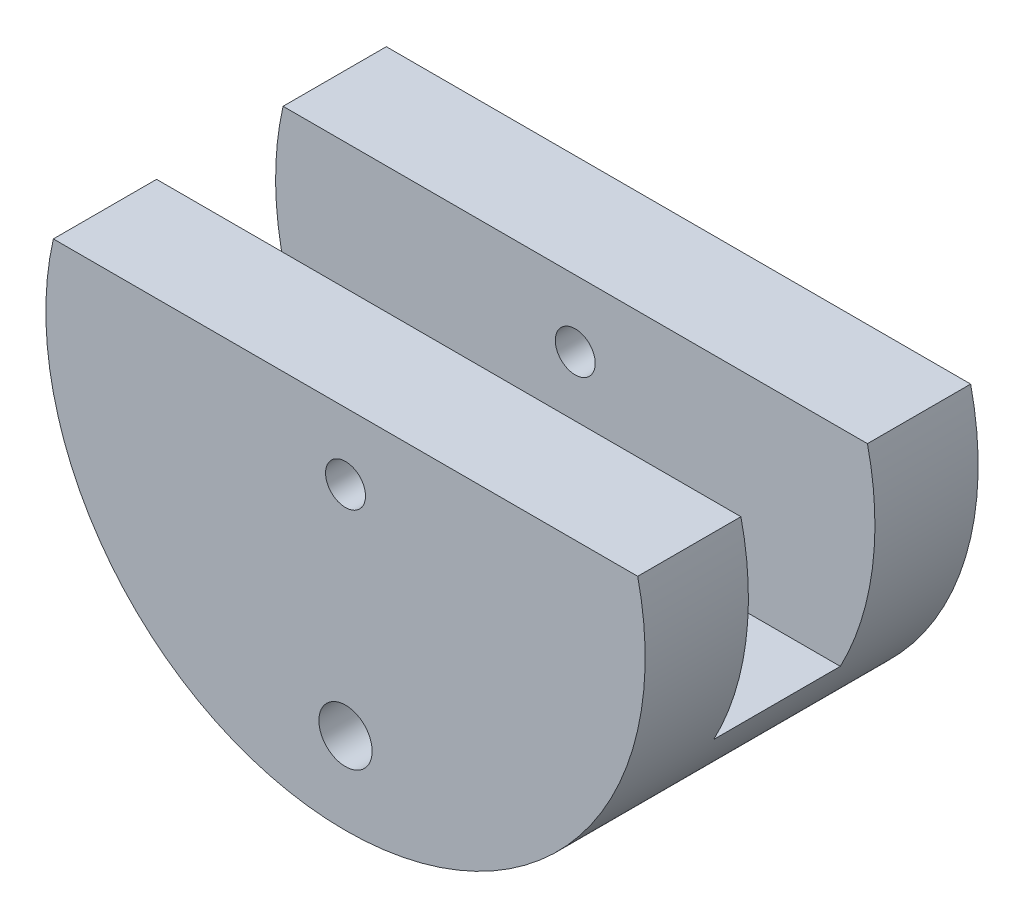
ISO-10303-21;
HEADER;
FILE_DESCRIPTION(('STEP AP214'),'2;1');
FILE_NAME('part.step','',(''),(''),'','','');
FILE_SCHEMA(('AUTOMOTIVE_DESIGN { 1 0 10303 214 1 1 1 1 }'));
ENDSEC;
DATA;
#1=APPLICATION_CONTEXT('core data for automotive mechanical design processes');
#2=APPLICATION_PROTOCOL_DEFINITION('international standard','automotive_design',2000,#1);
#3=PRODUCT_CONTEXT('',#1,'mechanical');
#4=PRODUCT('Part','Part','',(#3));
#5=PRODUCT_RELATED_PRODUCT_CATEGORY('part','',(#4));
#6=PRODUCT_DEFINITION_FORMATION('','',#4);
#7=PRODUCT_DEFINITION_CONTEXT('part definition',#1,'design');
#8=PRODUCT_DEFINITION('design','',#6,#7);
#9=PRODUCT_DEFINITION_SHAPE('','',#8);
#10=(LENGTH_UNIT() NAMED_UNIT(*) SI_UNIT(.MILLI.,.METRE.));
#11=(NAMED_UNIT(*) PLANE_ANGLE_UNIT() SI_UNIT($,.RADIAN.));
#12=(NAMED_UNIT(*) SI_UNIT($,.STERADIAN.) SOLID_ANGLE_UNIT());
#13=UNCERTAINTY_MEASURE_WITH_UNIT(LENGTH_MEASURE(1.E-05),#10,'distance_accuracy_value','');
#14=(GEOMETRIC_REPRESENTATION_CONTEXT(3) GLOBAL_UNCERTAINTY_ASSIGNED_CONTEXT((#13)) GLOBAL_UNIT_ASSIGNED_CONTEXT((#10,
#11,#12)) REPRESENTATION_CONTEXT('',''));
#15=CARTESIAN_POINT('',(0.,0.,0.));
#16=DIRECTION('',(0.,0.,1.));
#17=DIRECTION('',(1.,0.,0.));
#18=AXIS2_PLACEMENT_3D('',#15,#16,#17);
#19=CARTESIAN_POINT('',(0.,-32.69,25.));
#20=DIRECTION('',(0.,0.,-1.));
#21=DIRECTION('',(-1.,0.,0.));
#22=AXIS2_PLACEMENT_3D('',#19,#20,#21);
#23=CYLINDRICAL_SURFACE('',#22,4.);
#24=CARTESIAN_POINT('',(0.,-32.69,-25.));
#25=DIRECTION('',(0.,0.,1.));
#26=DIRECTION('',(1.,0.,0.));
#27=AXIS2_PLACEMENT_3D('',#24,#25,#26);
#28=CIRCLE('',#27,4.);
#29=CARTESIAN_POINT('',(4.00000000000001,-32.69,-25.));
#30=VERTEX_POINT('',#29);
#31=EDGE_CURVE('E178',#30,#30,#28,.T.);
#32=ORIENTED_EDGE('',*,*,#31,.F.);
#33=EDGE_LOOP('',(#32));
#34=FACE_BOUND('',#33,.T.);
#35=CARTESIAN_POINT('',(0.,-32.69,-3.));
#36=DIRECTION('',(0.,0.,1.));
#37=DIRECTION('',(1.,0.,0.));
#38=AXIS2_PLACEMENT_3D('',#35,#36,#37);
#39=CIRCLE('',#38,4.);
#40=CARTESIAN_POINT('',(4.00000000000001,-32.69,-3.));
#41=VERTEX_POINT('',#40);
#42=EDGE_CURVE('E153',#41,#41,#39,.T.);
#43=ORIENTED_EDGE('',*,*,#42,.T.);
#44=EDGE_LOOP('',(#43));
#45=FACE_BOUND('',#44,.T.);
#46=ADVANCED_FACE('F41',(#34,#45),#23,.F.);
#47=CARTESIAN_POINT('',(-53.1402546262414,-20.999444338544,-9.5));
#48=DIRECTION('',(0.,-1.,0.));
#49=DIRECTION('',(0.,0.,-1.));
#50=AXIS2_PLACEMENT_3D('',#47,#48,#49);
#51=PLANE('',#50);
#52=DIRECTION('',(1.,0.,0.));
#53=VECTOR('',#52,1.);
#54=CARTESIAN_POINT('',(-53.1402546262414,-20.999444338544,9.5));
#55=LINE('',#54,#53);
#56=CARTESIAN_POINT('',(-39.7997906712132,-20.999444338544,9.5));
#57=VERTEX_POINT('',#56);
#58=CARTESIAN_POINT('',(39.7997906712132,-20.999444338544,9.5));
#59=VERTEX_POINT('',#58);
#60=EDGE_CURVE('E156',#57,#59,#55,.T.);
#61=ORIENTED_EDGE('',*,*,#60,.T.);
#62=DIRECTION('',(0.,0.,-1.));
#63=VECTOR('',#62,1.);
#64=CARTESIAN_POINT('',(39.7997906712132,-20.999444338544,25.));
#65=LINE('',#64,#63);
#66=CARTESIAN_POINT('',(39.7997906712132,-20.999444338544,-9.5));
#67=VERTEX_POINT('',#66);
#68=EDGE_CURVE('E205',#67,#59,#65,.F.);
#69=ORIENTED_EDGE('',*,*,#68,.F.);
#70=DIRECTION('',(1.,0.,0.));
#71=VECTOR('',#70,1.);
#72=CARTESIAN_POINT('',(-53.1402546262414,-20.999444338544,-9.5));
#73=LINE('',#72,#71);
#74=CARTESIAN_POINT('',(-39.7997906712132,-20.999444338544,-9.5));
#75=VERTEX_POINT('',#74);
#76=EDGE_CURVE('E157',#75,#67,#73,.T.);
#77=ORIENTED_EDGE('',*,*,#76,.F.);
#78=DIRECTION('',(0.,0.,-1.));
#79=VECTOR('',#78,1.);
#80=CARTESIAN_POINT('',(-39.7997906712132,-20.999444338544,25.));
#81=LINE('',#80,#79);
#82=EDGE_CURVE('E212',#57,#75,#81,.T.);
#83=ORIENTED_EDGE('',*,*,#82,.F.);
#84=EDGE_LOOP('',(#61,#69,#77,#83));
#85=FACE_BOUND('',#84,.T.);
#86=DIRECTION('',(-1.,0.,0.));
#87=VECTOR('',#86,1.);
#88=CARTESIAN_POINT('',(-53.1402546262414,-20.999444338544,-3.));
#89=LINE('',#88,#87);
#90=CARTESIAN_POINT('',(8.40000000000001,-20.999444338544,-3.));
#91=VERTEX_POINT('',#90);
#92=CARTESIAN_POINT('',(-8.4,-20.999444338544,-3.));
#93=VERTEX_POINT('',#92);
#94=EDGE_CURVE('E11',#91,#93,#89,.T.);
#95=ORIENTED_EDGE('',*,*,#94,.F.);
#96=DIRECTION('',(0.,0.,1.));
#97=VECTOR('',#96,1.);
#98=CARTESIAN_POINT('',(8.4,-20.999444338544,-9.5));
#99=LINE('',#98,#97);
#100=CARTESIAN_POINT('',(8.40000000000001,-20.999444338544,3.));
#101=VERTEX_POINT('',#100);
#102=EDGE_CURVE('E135',#91,#101,#99,.T.);
#103=ORIENTED_EDGE('',*,*,#102,.T.);
#104=DIRECTION('',(-1.,0.,0.));
#105=VECTOR('',#104,1.);
#106=CARTESIAN_POINT('',(-53.1402546262414,-20.999444338544,3.));
#107=LINE('',#106,#105);
#108=CARTESIAN_POINT('',(-8.39999999999999,-20.999444338544,3.));
#109=VERTEX_POINT('',#108);
#110=EDGE_CURVE('E215',#101,#109,#107,.T.);
#111=ORIENTED_EDGE('',*,*,#110,.T.);
#112=DIRECTION('',(0.,0.,-1.));
#113=VECTOR('',#112,1.);
#114=CARTESIAN_POINT('',(-8.4,-20.999444338544,-9.5));
#115=LINE('',#114,#113);
#116=EDGE_CURVE('E49',#109,#93,#115,.T.);
#117=ORIENTED_EDGE('',*,*,#116,.T.);
#118=EDGE_LOOP('',(#95,#103,#111,#117));
#119=FACE_BOUND('',#118,.T.);
#120=ADVANCED_FACE('F220',(#85,#119),#51,.F.);
#121=CARTESIAN_POINT('',(0.,0.,25.));
#122=DIRECTION('',(0.,0.,-1.));
#123=DIRECTION('',(-1.,0.,0.));
#124=AXIS2_PLACEMENT_3D('',#121,#122,#123);
#125=CYLINDRICAL_SURFACE('',#124,45.);
#126=CARTESIAN_POINT('',(0.,0.,-9.5));
#127=DIRECTION('',(0.,0.,1.));
#128=DIRECTION('',(1.,0.,0.));
#129=AXIS2_PLACEMENT_3D('',#126,#127,#128);
#130=CIRCLE('',#129,45.);
#131=CARTESIAN_POINT('',(-43.8748219369606,10.,-9.5));
#132=VERTEX_POINT('',#131);
#133=EDGE_CURVE('E173',#132,#75,#130,.T.);
#134=ORIENTED_EDGE('',*,*,#133,.F.);
#135=DIRECTION('',(0.,0.,-1.));
#136=VECTOR('',#135,1.);
#137=CARTESIAN_POINT('',(-43.8748219369606,10.,25.));
#138=LINE('',#137,#136);
#139=CARTESIAN_POINT('',(-43.8748219369606,10.,-25.));
#140=VERTEX_POINT('',#139);
#141=EDGE_CURVE('E193',#132,#140,#138,.T.);
#142=ORIENTED_EDGE('',*,*,#141,.T.);
#143=CARTESIAN_POINT('',(0.,0.,-25.));
#144=DIRECTION('',(0.,0.,1.));
#145=DIRECTION('',(1.,0.,0.));
#146=AXIS2_PLACEMENT_3D('',#143,#144,#145);
#147=CIRCLE('',#146,45.);
#148=CARTESIAN_POINT('',(43.8748219369606,10.,-25.));
#149=VERTEX_POINT('',#148);
#150=EDGE_CURVE('E184',#140,#149,#147,.T.);
#151=ORIENTED_EDGE('',*,*,#150,.T.);
#152=DIRECTION('',(0.,0.,-1.));
#153=VECTOR('',#152,1.);
#154=CARTESIAN_POINT('',(43.8748219369606,10.,25.));
#155=LINE('',#154,#153);
#156=CARTESIAN_POINT('',(43.8748219369606,10.,-9.5));
#157=VERTEX_POINT('',#156);
#158=EDGE_CURVE('E201',#157,#149,#155,.T.);
#159=ORIENTED_EDGE('',*,*,#158,.F.);
#160=EDGE_CURVE('E170',#67,#157,#130,.T.);
#161=ORIENTED_EDGE('',*,*,#160,.F.);
#162=ORIENTED_EDGE('',*,*,#68,.T.);
#163=CARTESIAN_POINT('',(0.,0.,9.5));
#164=DIRECTION('',(0.,0.,1.));
#165=DIRECTION('',(1.,0.,0.));
#166=AXIS2_PLACEMENT_3D('',#163,#164,#165);
#167=CIRCLE('',#166,45.);
#168=CARTESIAN_POINT('',(43.8748219369606,10.,9.5));
#169=VERTEX_POINT('',#168);
#170=EDGE_CURVE('E165',#59,#169,#167,.T.);
#171=ORIENTED_EDGE('',*,*,#170,.T.);
#172=CARTESIAN_POINT('',(43.8748219369606,10.,25.));
#173=VERTEX_POINT('',#172);
#174=EDGE_CURVE('E202',#173,#169,#155,.T.);
#175=ORIENTED_EDGE('',*,*,#174,.F.);
#176=CARTESIAN_POINT('',(0.,0.,25.));
#177=DIRECTION('',(0.,0.,1.));
#178=DIRECTION('',(1.,0.,0.));
#179=AXIS2_PLACEMENT_3D('',#176,#177,#178);
#180=CIRCLE('',#179,45.);
#181=CARTESIAN_POINT('',(-43.8748219369606,10.,25.));
#182=VERTEX_POINT('',#181);
#183=EDGE_CURVE('E187',#182,#173,#180,.T.);
#184=ORIENTED_EDGE('',*,*,#183,.F.);
#185=CARTESIAN_POINT('',(-43.8748219369606,10.,9.5));
#186=VERTEX_POINT('',#185);
#187=EDGE_CURVE('E198',#182,#186,#138,.T.);
#188=ORIENTED_EDGE('',*,*,#187,.T.);
#189=EDGE_CURVE('E64',#186,#57,#167,.T.);
#190=ORIENTED_EDGE('',*,*,#189,.T.);
#191=ORIENTED_EDGE('',*,*,#82,.T.);
#192=EDGE_LOOP('',(#134,#142,#151,#159,#161,#162,#171,#175,#184,#188,#190,#191));
#193=FACE_BOUND('',#192,.T.);
#194=ADVANCED_FACE('F43',(#193),#125,.T.);
#195=CARTESIAN_POINT('',(-43.8748219369606,10.,25.));
#196=DIRECTION('',(0.,-1.,0.));
#197=DIRECTION('',(0.,0.,-1.));
#198=AXIS2_PLACEMENT_3D('',#195,#196,#197);
#199=PLANE('',#198);
#200=DIRECTION('',(-1.,0.,0.));
#201=VECTOR('',#200,1.);
#202=CARTESIAN_POINT('',(-43.8748219369606,10.,-9.5));
#203=LINE('',#202,#201);
#204=EDGE_CURVE('E168',#157,#132,#203,.T.);
#205=ORIENTED_EDGE('',*,*,#204,.F.);
#206=ORIENTED_EDGE('',*,*,#158,.T.);
#207=DIRECTION('',(-1.,0.,0.));
#208=VECTOR('',#207,1.);
#209=CARTESIAN_POINT('',(-43.8748219369606,10.,-25.));
#210=LINE('',#209,#208);
#211=EDGE_CURVE('E191',#149,#140,#210,.T.);
#212=ORIENTED_EDGE('',*,*,#211,.T.);
#213=ORIENTED_EDGE('',*,*,#141,.F.);
#214=EDGE_LOOP('',(#205,#206,#212,#213));
#215=FACE_BOUND('',#214,.T.);
#216=ADVANCED_FACE('F278',(#215),#199,.F.);
#217=CARTESIAN_POINT('',(0.,0.,25.));
#218=DIRECTION('',(0.,0.,-1.));
#219=DIRECTION('',(-1.,0.,0.));
#220=AXIS2_PLACEMENT_3D('',#217,#218,#219);
#221=CYLINDRICAL_SURFACE('',#220,3.);
#222=CARTESIAN_POINT('',(0.,0.,-25.));
#223=DIRECTION('',(0.,0.,1.));
#224=DIRECTION('',(1.,0.,0.));
#225=AXIS2_PLACEMENT_3D('',#222,#223,#224);
#226=CIRCLE('',#225,3.);
#227=CARTESIAN_POINT('',(3.,0.,-25.));
#228=VERTEX_POINT('',#227);
#229=EDGE_CURVE('E177',#228,#228,#226,.T.);
#230=ORIENTED_EDGE('',*,*,#229,.F.);
#231=EDGE_LOOP('',(#230));
#232=FACE_BOUND('',#231,.T.);
#233=CARTESIAN_POINT('',(0.,0.,-9.5));
#234=DIRECTION('',(0.,0.,1.));
#235=DIRECTION('',(1.,0.,0.));
#236=AXIS2_PLACEMENT_3D('',#233,#234,#235);
#237=CIRCLE('',#236,3.);
#238=CARTESIAN_POINT('',(3.,0.,-9.5));
#239=VERTEX_POINT('',#238);
#240=EDGE_CURVE('E171',#239,#239,#237,.T.);
#241=ORIENTED_EDGE('',*,*,#240,.T.);
#242=EDGE_LOOP('',(#241));
#243=FACE_BOUND('',#242,.T.);
#244=ADVANCED_FACE('F262',(#232,#243),#221,.F.);
#245=CARTESIAN_POINT('',(0.,0.,25.));
#246=DIRECTION('',(0.,0.,1.));
#247=DIRECTION('',(1.,0.,0.));
#248=AXIS2_PLACEMENT_3D('',#245,#246,#247);
#249=PLANE('',#248);
#250=CARTESIAN_POINT('',(0.,0.,25.));
#251=DIRECTION('',(0.,0.,1.));
#252=DIRECTION('',(1.,0.,0.));
#253=AXIS2_PLACEMENT_3D('',#250,#251,#252);
#254=CIRCLE('',#253,3.);
#255=CARTESIAN_POINT('',(3.,0.,25.));
#256=VERTEX_POINT('',#255);
#257=EDGE_CURVE('E181',#256,#256,#254,.T.);
#258=ORIENTED_EDGE('',*,*,#257,.F.);
#259=EDGE_LOOP('',(#258));
#260=FACE_BOUND('',#259,.T.);
#261=ORIENTED_EDGE('',*,*,#183,.T.);
#262=DIRECTION('',(-1.,0.,0.));
#263=VECTOR('',#262,1.);
#264=CARTESIAN_POINT('',(-43.8748219369606,10.,25.));
#265=LINE('',#264,#263);
#266=EDGE_CURVE('E190',#173,#182,#265,.T.);
#267=ORIENTED_EDGE('',*,*,#266,.T.);
#268=EDGE_LOOP('',(#261,#267));
#269=FACE_BOUND('',#268,.T.);
#270=CARTESIAN_POINT('',(0.,-32.69,25.));
#271=DIRECTION('',(0.,0.,1.));
#272=DIRECTION('',(1.,0.,0.));
#273=AXIS2_PLACEMENT_3D('',#270,#271,#272);
#274=CIRCLE('',#273,4.);
#275=CARTESIAN_POINT('',(4.00000000000001,-32.69,25.));
#276=VERTEX_POINT('',#275);
#277=EDGE_CURVE('E174',#276,#276,#274,.T.);
#278=ORIENTED_EDGE('',*,*,#277,.F.);
#279=EDGE_LOOP('',(#278));
#280=FACE_BOUND('',#279,.T.);
#281=ADVANCED_FACE('F267',(#260,#269,#280),#249,.T.);
#282=CARTESIAN_POINT('',(0.,0.,-25.));
#283=DIRECTION('',(0.,0.,1.));
#284=DIRECTION('',(1.,0.,0.));
#285=AXIS2_PLACEMENT_3D('',#282,#283,#284);
#286=PLANE('',#285);
#287=ORIENTED_EDGE('',*,*,#150,.F.);
#288=ORIENTED_EDGE('',*,*,#211,.F.);
#289=EDGE_LOOP('',(#287,#288));
#290=FACE_BOUND('',#289,.T.);
#291=ORIENTED_EDGE('',*,*,#229,.T.);
#292=EDGE_LOOP('',(#291));
#293=FACE_BOUND('',#292,.T.);
#294=ORIENTED_EDGE('',*,*,#31,.T.);
#295=EDGE_LOOP('',(#294));
#296=FACE_BOUND('',#295,.T.);
#297=ADVANCED_FACE('F269',(#290,#293,#296),#286,.F.);
#298=ORIENTED_EDGE('',*,*,#174,.T.);
#299=DIRECTION('',(-1.,0.,0.));
#300=VECTOR('',#299,1.);
#301=CARTESIAN_POINT('',(-43.8748219369606,10.,9.5));
#302=LINE('',#301,#300);
#303=EDGE_CURVE('E163',#169,#186,#302,.T.);
#304=ORIENTED_EDGE('',*,*,#303,.T.);
#305=ORIENTED_EDGE('',*,*,#187,.F.);
#306=ORIENTED_EDGE('',*,*,#266,.F.);
#307=EDGE_LOOP('',(#298,#304,#305,#306));
#308=FACE_BOUND('',#307,.T.);
#309=ADVANCED_FACE('F260',(#308),#199,.F.);
#310=CARTESIAN_POINT('',(0.,0.,9.5));
#311=DIRECTION('',(0.,0.,1.));
#312=DIRECTION('',(1.,0.,0.));
#313=AXIS2_PLACEMENT_3D('',#310,#311,#312);
#314=CIRCLE('',#313,3.);
#315=CARTESIAN_POINT('',(3.,0.,9.5));
#316=VERTEX_POINT('',#315);
#317=EDGE_CURVE('E160',#316,#316,#314,.T.);
#318=ORIENTED_EDGE('',*,*,#317,.F.);
#319=EDGE_LOOP('',(#318));
#320=FACE_BOUND('',#319,.T.);
#321=ORIENTED_EDGE('',*,*,#257,.T.);
#322=EDGE_LOOP('',(#321));
#323=FACE_BOUND('',#322,.T.);
#324=ADVANCED_FACE('F250',(#320,#323),#221,.F.);
#325=CARTESIAN_POINT('',(0.,-32.69,3.));
#326=DIRECTION('',(0.,0.,1.));
#327=DIRECTION('',(1.,0.,0.));
#328=AXIS2_PLACEMENT_3D('',#325,#326,#327);
#329=CIRCLE('',#328,4.);
#330=CARTESIAN_POINT('',(4.00000000000001,-32.69,3.));
#331=VERTEX_POINT('',#330);
#332=EDGE_CURVE('E149',#331,#331,#329,.T.);
#333=ORIENTED_EDGE('',*,*,#332,.F.);
#334=EDGE_LOOP('',(#333));
#335=FACE_BOUND('',#334,.T.);
#336=ORIENTED_EDGE('',*,*,#277,.T.);
#337=EDGE_LOOP('',(#336));
#338=FACE_BOUND('',#337,.T.);
#339=ADVANCED_FACE('F238',(#335,#338),#23,.F.);
#340=CARTESIAN_POINT('',(0.,0.,-9.5));
#341=DIRECTION('',(0.,0.,1.));
#342=DIRECTION('',(1.,0.,0.));
#343=AXIS2_PLACEMENT_3D('',#340,#341,#342);
#344=PLANE('',#343);
#345=ORIENTED_EDGE('',*,*,#240,.F.);
#346=EDGE_LOOP('',(#345));
#347=FACE_BOUND('',#346,.T.);
#348=ORIENTED_EDGE('',*,*,#133,.T.);
#349=ORIENTED_EDGE('',*,*,#76,.T.);
#350=ORIENTED_EDGE('',*,*,#160,.T.);
#351=ORIENTED_EDGE('',*,*,#204,.T.);
#352=EDGE_LOOP('',(#348,#349,#350,#351));
#353=FACE_BOUND('',#352,.T.);
#354=ADVANCED_FACE('F249',(#347,#353),#344,.T.);
#355=CARTESIAN_POINT('',(0.,0.,9.5));
#356=DIRECTION('',(0.,0.,1.));
#357=DIRECTION('',(1.,0.,0.));
#358=AXIS2_PLACEMENT_3D('',#355,#356,#357);
#359=PLANE('',#358);
#360=ORIENTED_EDGE('',*,*,#317,.T.);
#361=EDGE_LOOP('',(#360));
#362=FACE_BOUND('',#361,.T.);
#363=ORIENTED_EDGE('',*,*,#303,.F.);
#364=ORIENTED_EDGE('',*,*,#170,.F.);
#365=ORIENTED_EDGE('',*,*,#60,.F.);
#366=ORIENTED_EDGE('',*,*,#189,.F.);
#367=EDGE_LOOP('',(#363,#364,#365,#366));
#368=FACE_BOUND('',#367,.T.);
#369=ADVANCED_FACE('F256',(#362,#368),#359,.F.);
#370=CARTESIAN_POINT('',(-8.4,-32.69,-3.));
#371=DIRECTION('',(-1.,0.,0.));
#372=DIRECTION('',(0.,0.,1.));
#373=AXIS2_PLACEMENT_3D('',#370,#371,#372);
#374=PLANE('',#373);
#375=DIRECTION('',(0.,-1.,0.));
#376=VECTOR('',#375,1.);
#377=CARTESIAN_POINT('',(-8.4,-32.69,3.));
#378=LINE('',#377,#376);
#379=CARTESIAN_POINT('',(-8.4,-32.69,3.));
#380=VERTEX_POINT('',#379);
#381=EDGE_CURVE('E56',#109,#380,#378,.T.);
#382=ORIENTED_EDGE('',*,*,#381,.T.);
#383=DIRECTION('',(0.,0.,1.));
#384=VECTOR('',#383,1.);
#385=CARTESIAN_POINT('',(-8.4,-32.69,-3.));
#386=LINE('',#385,#384);
#387=CARTESIAN_POINT('',(-8.4,-32.69,-3.));
#388=VERTEX_POINT('',#387);
#389=EDGE_CURVE('E128',#388,#380,#386,.T.);
#390=ORIENTED_EDGE('',*,*,#389,.F.);
#391=DIRECTION('',(0.,-1.,0.));
#392=VECTOR('',#391,1.);
#393=CARTESIAN_POINT('',(-8.4,-32.69,-3.));
#394=LINE('',#393,#392);
#395=EDGE_CURVE('E129',#93,#388,#394,.T.);
#396=ORIENTED_EDGE('',*,*,#395,.F.);
#397=ORIENTED_EDGE('',*,*,#116,.F.);
#398=EDGE_LOOP('',(#382,#390,#396,#397));
#399=FACE_BOUND('',#398,.T.);
#400=ADVANCED_FACE('F222',(#399),#374,.F.);
#401=CARTESIAN_POINT('',(8.40000000000001,-18.964049074847,-3.));
#402=DIRECTION('',(1.,0.,0.));
#403=DIRECTION('',(0.,0.,-1.));
#404=AXIS2_PLACEMENT_3D('',#401,#402,#403);
#405=PLANE('',#404);
#406=DIRECTION('',(0.,1.,0.));
#407=VECTOR('',#406,1.);
#408=CARTESIAN_POINT('',(8.40000000000001,-18.964049074847,-3.));
#409=LINE('',#408,#407);
#410=CARTESIAN_POINT('',(8.40000000000001,-32.69,-3.));
#411=VERTEX_POINT('',#410);
#412=EDGE_CURVE('E132',#411,#91,#409,.T.);
#413=ORIENTED_EDGE('',*,*,#412,.F.);
#414=DIRECTION('',(0.,0.,1.));
#415=VECTOR('',#414,1.);
#416=CARTESIAN_POINT('',(8.40000000000001,-32.69,-3.));
#417=LINE('',#416,#415);
#418=CARTESIAN_POINT('',(8.40000000000001,-32.69,3.));
#419=VERTEX_POINT('',#418);
#420=EDGE_CURVE('E118',#411,#419,#417,.T.);
#421=ORIENTED_EDGE('',*,*,#420,.T.);
#422=DIRECTION('',(0.,1.,0.));
#423=VECTOR('',#422,1.);
#424=CARTESIAN_POINT('',(8.40000000000001,-18.964049074847,3.));
#425=LINE('',#424,#423);
#426=EDGE_CURVE('E143',#419,#101,#425,.T.);
#427=ORIENTED_EDGE('',*,*,#426,.T.);
#428=ORIENTED_EDGE('',*,*,#102,.F.);
#429=EDGE_LOOP('',(#413,#421,#427,#428));
#430=FACE_BOUND('',#429,.T.);
#431=ADVANCED_FACE('F133',(#430),#405,.F.);
#432=CARTESIAN_POINT('',(0.,-32.69,-3.));
#433=DIRECTION('',(0.,0.,1.));
#434=DIRECTION('',(1.,0.,0.));
#435=AXIS2_PLACEMENT_3D('',#432,#433,#434);
#436=PLANE('',#435);
#437=ORIENTED_EDGE('',*,*,#42,.F.);
#438=EDGE_LOOP('',(#437));
#439=FACE_BOUND('',#438,.T.);
#440=ORIENTED_EDGE('',*,*,#94,.T.);
#441=ORIENTED_EDGE('',*,*,#395,.T.);
#442=CARTESIAN_POINT('',(0.,-32.69,-3.));
#443=DIRECTION('',(0.,0.,1.));
#444=DIRECTION('',(1.,0.,0.));
#445=AXIS2_PLACEMENT_3D('',#442,#443,#444);
#446=CIRCLE('',#445,8.4);
#447=EDGE_CURVE('E123',#388,#411,#446,.T.);
#448=ORIENTED_EDGE('',*,*,#447,.T.);
#449=ORIENTED_EDGE('',*,*,#412,.T.);
#450=EDGE_LOOP('',(#440,#441,#448,#449));
#451=FACE_BOUND('',#450,.T.);
#452=ADVANCED_FACE('F139',(#439,#451),#436,.T.);
#453=CARTESIAN_POINT('',(0.,-32.69,3.));
#454=DIRECTION('',(0.,0.,1.));
#455=DIRECTION('',(1.,0.,0.));
#456=AXIS2_PLACEMENT_3D('',#453,#454,#455);
#457=PLANE('',#456);
#458=ORIENTED_EDGE('',*,*,#332,.T.);
#459=EDGE_LOOP('',(#458));
#460=FACE_BOUND('',#459,.T.);
#461=ORIENTED_EDGE('',*,*,#426,.F.);
#462=CARTESIAN_POINT('',(0.,-32.69,3.));
#463=DIRECTION('',(0.,0.,1.));
#464=DIRECTION('',(1.,0.,0.));
#465=AXIS2_PLACEMENT_3D('',#462,#463,#464);
#466=CIRCLE('',#465,8.4);
#467=EDGE_CURVE('E124',#380,#419,#466,.T.);
#468=ORIENTED_EDGE('',*,*,#467,.F.);
#469=ORIENTED_EDGE('',*,*,#381,.F.);
#470=ORIENTED_EDGE('',*,*,#110,.F.);
#471=EDGE_LOOP('',(#461,#468,#469,#470));
#472=FACE_BOUND('',#471,.T.);
#473=ADVANCED_FACE('F223',(#460,#472),#457,.F.);
#474=CARTESIAN_POINT('',(0.,-32.69,-3.));
#475=DIRECTION('',(0.,0.,1.));
#476=DIRECTION('',(1.,0.,0.));
#477=AXIS2_PLACEMENT_3D('',#474,#475,#476);
#478=CYLINDRICAL_SURFACE('',#477,8.4);
#479=ORIENTED_EDGE('',*,*,#467,.T.);
#480=ORIENTED_EDGE('',*,*,#420,.F.);
#481=ORIENTED_EDGE('',*,*,#447,.F.);
#482=ORIENTED_EDGE('',*,*,#389,.T.);
#483=EDGE_LOOP('',(#479,#480,#481,#482));
#484=FACE_BOUND('',#483,.T.);
#485=ADVANCED_FACE('F120',(#484),#478,.F.);
#486=CLOSED_SHELL('',(#46,#120,#194,#216,#244,#281,#297,#309,#324,#339,#354,#369,#400,#431,#452,
#473,#485));
#487=MANIFOLD_SOLID_BREP('B2',#486);
#488=ADVANCED_BREP_SHAPE_REPRESENTATION('',(#18,#487),#14);
#489=SHAPE_DEFINITION_REPRESENTATION(#9,#488);
ENDSEC;
END-ISO-10303-21;
